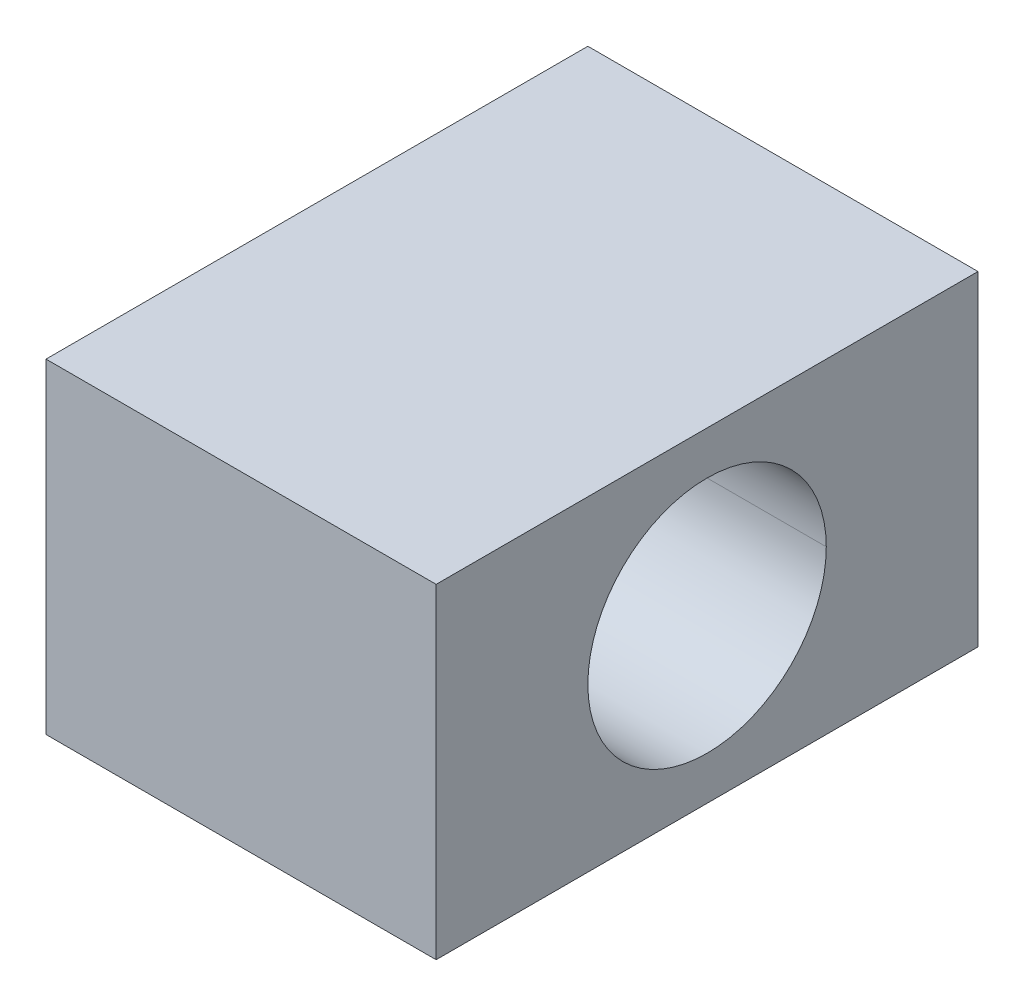
ISO-10303-21;
HEADER;
FILE_DESCRIPTION(('STEP AP214'),'2;1');
FILE_NAME('part.step','',(''),(''),'','','');
FILE_SCHEMA(('AUTOMOTIVE_DESIGN { 1 0 10303 214 1 1 1 1 }'));
ENDSEC;
DATA;
#1=APPLICATION_CONTEXT('core data for automotive mechanical design processes');
#2=APPLICATION_PROTOCOL_DEFINITION('international standard','automotive_design',2000,#1);
#3=PRODUCT_CONTEXT('',#1,'mechanical');
#4=PRODUCT('Part','Part','',(#3));
#5=PRODUCT_RELATED_PRODUCT_CATEGORY('part','',(#4));
#6=PRODUCT_DEFINITION_FORMATION('','',#4);
#7=PRODUCT_DEFINITION_CONTEXT('part definition',#1,'design');
#8=PRODUCT_DEFINITION('design','',#6,#7);
#9=PRODUCT_DEFINITION_SHAPE('','',#8);
#10=(LENGTH_UNIT() NAMED_UNIT(*) SI_UNIT(.MILLI.,.METRE.));
#11=(NAMED_UNIT(*) PLANE_ANGLE_UNIT() SI_UNIT($,.RADIAN.));
#12=(NAMED_UNIT(*) SI_UNIT($,.STERADIAN.) SOLID_ANGLE_UNIT());
#13=UNCERTAINTY_MEASURE_WITH_UNIT(LENGTH_MEASURE(1.E-05),#10,'distance_accuracy_value','');
#14=(GEOMETRIC_REPRESENTATION_CONTEXT(3) GLOBAL_UNCERTAINTY_ASSIGNED_CONTEXT((#13)) GLOBAL_UNIT_ASSIGNED_CONTEXT((#10,
#11,#12)) REPRESENTATION_CONTEXT('',''));
#15=CARTESIAN_POINT('',(0.,0.,0.));
#16=DIRECTION('',(0.,0.,1.));
#17=DIRECTION('',(1.,0.,0.));
#18=AXIS2_PLACEMENT_3D('',#15,#16,#17);
#19=CARTESIAN_POINT('',(-30.,-15.,-17.5));
#20=DIRECTION('',(0.,-1.,0.));
#21=DIRECTION('',(0.,0.,-1.));
#22=AXIS2_PLACEMENT_3D('',#19,#20,#21);
#23=CYLINDRICAL_SURFACE('',#22,2.1);
#24=CARTESIAN_POINT('',(-30.,-1.,-17.5));
#25=DIRECTION('',(0.,-1.,0.));
#26=DIRECTION('',(0.,0.,-1.));
#27=AXIS2_PLACEMENT_3D('',#24,#25,#26);
#28=CIRCLE('',#27,2.1);
#29=CARTESIAN_POINT('',(-30.,-1.,-15.4));
#30=VERTEX_POINT('',#29);
#31=CARTESIAN_POINT('',(-30.,-1.,-19.6));
#32=VERTEX_POINT('',#31);
#33=EDGE_CURVE('E41',#30,#32,#28,.T.);
#34=ORIENTED_EDGE('',*,*,#33,.F.);
#35=DIRECTION('',(0.,-1.,0.));
#36=VECTOR('',#35,1.);
#37=CARTESIAN_POINT('',(-30.,-15.,-15.4));
#38=LINE('',#37,#36);
#39=CARTESIAN_POINT('',(-30.,-15.,-15.4));
#40=VERTEX_POINT('',#39);
#41=EDGE_CURVE('E11',#30,#40,#38,.T.);
#42=ORIENTED_EDGE('',*,*,#41,.T.);
#43=CARTESIAN_POINT('',(-30.,-15.,-17.5));
#44=DIRECTION('',(0.,-1.,0.));
#45=DIRECTION('',(0.,0.,-1.));
#46=AXIS2_PLACEMENT_3D('',#43,#44,#45);
#47=CIRCLE('',#46,2.1);
#48=CARTESIAN_POINT('',(-30.,-15.,-19.6));
#49=VERTEX_POINT('',#48);
#50=EDGE_CURVE('E27',#40,#49,#47,.T.);
#51=ORIENTED_EDGE('',*,*,#50,.T.);
#52=DIRECTION('',(0.,-1.,0.));
#53=VECTOR('',#52,1.);
#54=CARTESIAN_POINT('',(-30.,-15.,-19.6));
#55=LINE('',#54,#53);
#56=EDGE_CURVE('E356',#32,#49,#55,.T.);
#57=ORIENTED_EDGE('',*,*,#56,.F.);
#58=EDGE_LOOP('',(#34,#42,#51,#57));
#59=FACE_BOUND('',#58,.T.);
#60=ADVANCED_FACE('F16',(#59),#23,.F.);
#61=CARTESIAN_POINT('',(-30.,-1.,-17.5));
#62=DIRECTION('',(0.,-1.,0.));
#63=DIRECTION('',(0.,0.,-1.));
#64=AXIS2_PLACEMENT_3D('',#61,#62,#63);
#65=CONICAL_SURFACE('',#64,2.1,1.02974425867665);
#66=DIRECTION('',(0.,-0.515038074910055,-0.857167300702112));
#67=VECTOR('',#66,1.);
#68=CARTESIAN_POINT('',(-30.,-1.,-19.6));
#69=LINE('',#68,#67);
#70=CARTESIAN_POINT('',(-30.,0.261807299957877,-17.5));
#71=VERTEX_POINT('',#70);
#72=EDGE_CURVE('E324',#71,#32,#69,.T.);
#73=ORIENTED_EDGE('',*,*,#72,.F.);
#74=DIRECTION('',(0.,-0.515038074910055,0.857167300702112));
#75=VECTOR('',#74,1.);
#76=CARTESIAN_POINT('',(-30.,-1.,-15.4));
#77=LINE('',#76,#75);
#78=EDGE_CURVE('E325',#71,#30,#77,.T.);
#79=ORIENTED_EDGE('',*,*,#78,.T.);
#80=ORIENTED_EDGE('',*,*,#33,.T.);
#81=EDGE_LOOP('',(#73,#79,#80));
#82=FACE_BOUND('',#81,.T.);
#83=ADVANCED_FACE('F489',(#82),#65,.F.);
#84=CARTESIAN_POINT('',(-30.,-15.,17.5));
#85=DIRECTION('',(0.,-1.,0.));
#86=DIRECTION('',(0.,0.,-1.));
#87=AXIS2_PLACEMENT_3D('',#84,#85,#86);
#88=CYLINDRICAL_SURFACE('',#87,2.1);
#89=CARTESIAN_POINT('',(-30.,-1.,17.5));
#90=DIRECTION('',(0.,-1.,0.));
#91=DIRECTION('',(0.,0.,-1.));
#92=AXIS2_PLACEMENT_3D('',#89,#90,#91);
#93=CIRCLE('',#92,2.1);
#94=CARTESIAN_POINT('',(-30.,-1.,19.6));
#95=VERTEX_POINT('',#94);
#96=CARTESIAN_POINT('',(-30.,-1.,15.4));
#97=VERTEX_POINT('',#96);
#98=EDGE_CURVE('E289',#95,#97,#93,.T.);
#99=ORIENTED_EDGE('',*,*,#98,.F.);
#100=DIRECTION('',(0.,-1.,0.));
#101=VECTOR('',#100,1.);
#102=CARTESIAN_POINT('',(-30.,-15.,19.6));
#103=LINE('',#102,#101);
#104=CARTESIAN_POINT('',(-30.,-15.,19.6));
#105=VERTEX_POINT('',#104);
#106=EDGE_CURVE('E228',#95,#105,#103,.T.);
#107=ORIENTED_EDGE('',*,*,#106,.T.);
#108=CARTESIAN_POINT('',(-30.,-15.,17.5));
#109=DIRECTION('',(0.,-1.,0.));
#110=DIRECTION('',(0.,0.,-1.));
#111=AXIS2_PLACEMENT_3D('',#108,#109,#110);
#112=CIRCLE('',#111,2.1);
#113=CARTESIAN_POINT('',(-30.,-15.,15.4));
#114=VERTEX_POINT('',#113);
#115=EDGE_CURVE('E230',#105,#114,#112,.T.);
#116=ORIENTED_EDGE('',*,*,#115,.T.);
#117=DIRECTION('',(0.,-1.,0.));
#118=VECTOR('',#117,1.);
#119=CARTESIAN_POINT('',(-30.,-15.,15.4));
#120=LINE('',#119,#118);
#121=EDGE_CURVE('E303',#97,#114,#120,.T.);
#122=ORIENTED_EDGE('',*,*,#121,.F.);
#123=EDGE_LOOP('',(#99,#107,#116,#122));
#124=FACE_BOUND('',#123,.T.);
#125=ADVANCED_FACE('F484',(#124),#88,.F.);
#126=CARTESIAN_POINT('',(-30.,-1.,17.5));
#127=DIRECTION('',(0.,-1.,0.));
#128=DIRECTION('',(0.,0.,-1.));
#129=AXIS2_PLACEMENT_3D('',#126,#127,#128);
#130=CONICAL_SURFACE('',#129,2.1,1.02974425867665);
#131=DIRECTION('',(0.,-0.515038074910055,-0.857167300702112));
#132=VECTOR('',#131,1.);
#133=CARTESIAN_POINT('',(-30.,-1.,15.4));
#134=LINE('',#133,#132);
#135=CARTESIAN_POINT('',(-30.,0.261807299957877,17.5));
#136=VERTEX_POINT('',#135);
#137=EDGE_CURVE('E370',#136,#97,#134,.T.);
#138=ORIENTED_EDGE('',*,*,#137,.F.);
#139=DIRECTION('',(0.,-0.515038074910055,0.857167300702112));
#140=VECTOR('',#139,1.);
#141=CARTESIAN_POINT('',(-30.,-1.,19.6));
#142=LINE('',#141,#140);
#143=EDGE_CURVE('E287',#136,#95,#142,.T.);
#144=ORIENTED_EDGE('',*,*,#143,.T.);
#145=ORIENTED_EDGE('',*,*,#98,.T.);
#146=EDGE_LOOP('',(#138,#144,#145));
#147=FACE_BOUND('',#146,.T.);
#148=ADVANCED_FACE('F18',(#147),#130,.F.);
#149=CARTESIAN_POINT('',(-6.,-15.,17.5));
#150=DIRECTION('',(0.,-1.,0.));
#151=DIRECTION('',(0.,0.,-1.));
#152=AXIS2_PLACEMENT_3D('',#149,#150,#151);
#153=CYLINDRICAL_SURFACE('',#152,2.1);
#154=CARTESIAN_POINT('',(-6.,-1.,17.5));
#155=DIRECTION('',(0.,-1.,0.));
#156=DIRECTION('',(0.,0.,-1.));
#157=AXIS2_PLACEMENT_3D('',#154,#155,#156);
#158=CIRCLE('',#157,2.1);
#159=CARTESIAN_POINT('',(-6.,-1.,19.6));
#160=VERTEX_POINT('',#159);
#161=CARTESIAN_POINT('',(-6.,-1.,15.4));
#162=VERTEX_POINT('',#161);
#163=EDGE_CURVE('E191',#160,#162,#158,.T.);
#164=ORIENTED_EDGE('',*,*,#163,.F.);
#165=DIRECTION('',(0.,-1.,0.));
#166=VECTOR('',#165,1.);
#167=CARTESIAN_POINT('',(-6.,-15.,19.6));
#168=LINE('',#167,#166);
#169=CARTESIAN_POINT('',(-6.,-15.,19.6));
#170=VERTEX_POINT('',#169);
#171=EDGE_CURVE('E218',#160,#170,#168,.T.);
#172=ORIENTED_EDGE('',*,*,#171,.T.);
#173=CARTESIAN_POINT('',(-6.,-15.,17.5));
#174=DIRECTION('',(0.,-1.,0.));
#175=DIRECTION('',(0.,0.,-1.));
#176=AXIS2_PLACEMENT_3D('',#173,#174,#175);
#177=CIRCLE('',#176,2.1);
#178=CARTESIAN_POINT('',(-6.,-15.,15.4));
#179=VERTEX_POINT('',#178);
#180=EDGE_CURVE('E193',#170,#179,#177,.T.);
#181=ORIENTED_EDGE('',*,*,#180,.T.);
#182=DIRECTION('',(0.,-1.,0.));
#183=VECTOR('',#182,1.);
#184=CARTESIAN_POINT('',(-6.,-15.,15.4));
#185=LINE('',#184,#183);
#186=EDGE_CURVE('E186',#162,#179,#185,.T.);
#187=ORIENTED_EDGE('',*,*,#186,.F.);
#188=EDGE_LOOP('',(#164,#172,#181,#187));
#189=FACE_BOUND('',#188,.T.);
#190=ADVANCED_FACE('F188',(#189),#153,.F.);
#191=CARTESIAN_POINT('',(-6.,-1.,17.5));
#192=DIRECTION('',(0.,-1.,0.));
#193=DIRECTION('',(0.,0.,-1.));
#194=AXIS2_PLACEMENT_3D('',#191,#192,#193);
#195=CONICAL_SURFACE('',#194,2.1,1.02974425867665);
#196=DIRECTION('',(0.,-0.515038074910055,-0.857167300702112));
#197=VECTOR('',#196,1.);
#198=CARTESIAN_POINT('',(-6.,-1.,15.4));
#199=LINE('',#198,#197);
#200=CARTESIAN_POINT('',(-6.,0.261807299957877,17.5));
#201=VERTEX_POINT('',#200);
#202=EDGE_CURVE('E205',#201,#162,#199,.T.);
#203=ORIENTED_EDGE('',*,*,#202,.F.);
#204=DIRECTION('',(0.,-0.515038074910055,0.857167300702112));
#205=VECTOR('',#204,1.);
#206=CARTESIAN_POINT('',(-6.,-1.,19.6));
#207=LINE('',#206,#205);
#208=EDGE_CURVE('E207',#201,#160,#207,.T.);
#209=ORIENTED_EDGE('',*,*,#208,.T.);
#210=ORIENTED_EDGE('',*,*,#163,.T.);
#211=EDGE_LOOP('',(#203,#209,#210));
#212=FACE_BOUND('',#211,.T.);
#213=ADVANCED_FACE('F212',(#212),#195,.F.);
#214=CARTESIAN_POINT('',(-6.,-15.,-17.5));
#215=DIRECTION('',(0.,-1.,0.));
#216=DIRECTION('',(0.,0.,-1.));
#217=AXIS2_PLACEMENT_3D('',#214,#215,#216);
#218=CYLINDRICAL_SURFACE('',#217,2.1);
#219=CARTESIAN_POINT('',(-6.,-1.,-17.5));
#220=DIRECTION('',(0.,-1.,0.));
#221=DIRECTION('',(0.,0.,-1.));
#222=AXIS2_PLACEMENT_3D('',#219,#220,#221);
#223=CIRCLE('',#222,2.1);
#224=CARTESIAN_POINT('',(-6.,-1.,-15.4));
#225=VERTEX_POINT('',#224);
#226=CARTESIAN_POINT('',(-6.,-1.,-19.6));
#227=VERTEX_POINT('',#226);
#228=EDGE_CURVE('E330',#225,#227,#223,.T.);
#229=ORIENTED_EDGE('',*,*,#228,.F.);
#230=DIRECTION('',(0.,-1.,0.));
#231=VECTOR('',#230,1.);
#232=CARTESIAN_POINT('',(-6.,-15.,-15.4));
#233=LINE('',#232,#231);
#234=CARTESIAN_POINT('',(-6.,-15.,-15.4));
#235=VERTEX_POINT('',#234);
#236=EDGE_CURVE('E215',#225,#235,#233,.T.);
#237=ORIENTED_EDGE('',*,*,#236,.T.);
#238=CARTESIAN_POINT('',(-6.,-15.,-17.5));
#239=DIRECTION('',(0.,-1.,0.));
#240=DIRECTION('',(0.,0.,-1.));
#241=AXIS2_PLACEMENT_3D('',#238,#239,#240);
#242=CIRCLE('',#241,2.1);
#243=CARTESIAN_POINT('',(-6.,-15.,-19.6));
#244=VERTEX_POINT('',#243);
#245=EDGE_CURVE('E307',#235,#244,#242,.T.);
#246=ORIENTED_EDGE('',*,*,#245,.T.);
#247=DIRECTION('',(0.,-1.,0.));
#248=VECTOR('',#247,1.);
#249=CARTESIAN_POINT('',(-6.,-15.,-19.6));
#250=LINE('',#249,#248);
#251=EDGE_CURVE('E235',#227,#244,#250,.T.);
#252=ORIENTED_EDGE('',*,*,#251,.F.);
#253=EDGE_LOOP('',(#229,#237,#246,#252));
#254=FACE_BOUND('',#253,.T.);
#255=ADVANCED_FACE('F424',(#254),#218,.F.);
#256=CARTESIAN_POINT('',(-6.,-1.,-17.5));
#257=DIRECTION('',(0.,-1.,0.));
#258=DIRECTION('',(0.,0.,-1.));
#259=AXIS2_PLACEMENT_3D('',#256,#257,#258);
#260=CONICAL_SURFACE('',#259,2.1,1.02974425867665);
#261=DIRECTION('',(0.,-0.515038074910055,-0.857167300702112));
#262=VECTOR('',#261,1.);
#263=CARTESIAN_POINT('',(-6.,-1.,-19.6));
#264=LINE('',#263,#262);
#265=CARTESIAN_POINT('',(-6.,0.261807299957877,-17.5));
#266=VERTEX_POINT('',#265);
#267=EDGE_CURVE('E234',#266,#227,#264,.T.);
#268=ORIENTED_EDGE('',*,*,#267,.F.);
#269=DIRECTION('',(0.,-0.515038074910055,0.857167300702112));
#270=VECTOR('',#269,1.);
#271=CARTESIAN_POINT('',(-6.,-1.,-15.4));
#272=LINE('',#271,#270);
#273=EDGE_CURVE('E334',#266,#225,#272,.T.);
#274=ORIENTED_EDGE('',*,*,#273,.T.);
#275=ORIENTED_EDGE('',*,*,#228,.T.);
#276=EDGE_LOOP('',(#268,#274,#275));
#277=FACE_BOUND('',#276,.T.);
#278=ADVANCED_FACE('F427',(#277),#260,.F.);
#279=CARTESIAN_POINT('',(-36.,0.,0.));
#280=DIRECTION('',(1.,0.,0.));
#281=DIRECTION('',(0.,0.,-1.));
#282=AXIS2_PLACEMENT_3D('',#279,#280,#281);
#283=CYLINDRICAL_SURFACE('',#282,11.);
#284=CARTESIAN_POINT('',(-36.,0.,0.));
#285=DIRECTION('',(-1.,0.,0.));
#286=DIRECTION('',(0.,0.,1.));
#287=AXIS2_PLACEMENT_3D('',#284,#285,#286);
#288=CIRCLE('',#287,11.);
#289=CARTESIAN_POINT('',(-36.,0.,-11.));
#290=VERTEX_POINT('',#289);
#291=CARTESIAN_POINT('',(-36.,0.,11.));
#292=VERTEX_POINT('',#291);
#293=EDGE_CURVE('E318',#290,#292,#288,.T.);
#294=ORIENTED_EDGE('',*,*,#293,.T.);
#295=DIRECTION('',(1.,0.,0.));
#296=VECTOR('',#295,1.);
#297=CARTESIAN_POINT('',(-36.,0.,11.));
#298=LINE('',#297,#296);
#299=CARTESIAN_POINT('',(0.,0.,11.));
#300=VERTEX_POINT('',#299);
#301=EDGE_CURVE('E314',#292,#300,#298,.T.);
#302=ORIENTED_EDGE('',*,*,#301,.T.);
#303=CARTESIAN_POINT('',(0.,0.,0.));
#304=DIRECTION('',(-1.,0.,0.));
#305=DIRECTION('',(0.,0.,1.));
#306=AXIS2_PLACEMENT_3D('',#303,#304,#305);
#307=CIRCLE('',#306,11.);
#308=CARTESIAN_POINT('',(0.,0.,-11.));
#309=VERTEX_POINT('',#308);
#310=EDGE_CURVE('E312',#309,#300,#307,.T.);
#311=ORIENTED_EDGE('',*,*,#310,.F.);
#312=DIRECTION('',(1.,0.,0.));
#313=VECTOR('',#312,1.);
#314=CARTESIAN_POINT('',(-36.,0.,-11.));
#315=LINE('',#314,#313);
#316=EDGE_CURVE('E244',#290,#309,#315,.T.);
#317=ORIENTED_EDGE('',*,*,#316,.F.);
#318=EDGE_LOOP('',(#294,#302,#311,#317));
#319=FACE_BOUND('',#318,.T.);
#320=ADVANCED_FACE('F636',(#319),#283,.F.);
#321=CARTESIAN_POINT('',(-36.,0.,0.));
#322=DIRECTION('',(-1.,0.,0.));
#323=DIRECTION('',(0.,0.,1.));
#324=AXIS2_PLACEMENT_3D('',#321,#322,#323);
#325=PLANE('',#324);
#326=DIRECTION('',(0.,0.,1.));
#327=VECTOR('',#326,1.);
#328=CARTESIAN_POINT('',(-36.,-15.,25.));
#329=LINE('',#328,#327);
#330=CARTESIAN_POINT('',(-36.,-15.,-25.));
#331=VERTEX_POINT('',#330);
#332=CARTESIAN_POINT('',(-36.,-15.,25.));
#333=VERTEX_POINT('',#332);
#334=EDGE_CURVE('E319',#331,#333,#329,.T.);
#335=ORIENTED_EDGE('',*,*,#334,.T.);
#336=DIRECTION('',(0.,1.,0.));
#337=VECTOR('',#336,1.);
#338=CARTESIAN_POINT('',(-36.,15.,25.));
#339=LINE('',#338,#337);
#340=CARTESIAN_POINT('',(-36.,15.,25.));
#341=VERTEX_POINT('',#340);
#342=EDGE_CURVE('E259',#333,#341,#339,.T.);
#343=ORIENTED_EDGE('',*,*,#342,.T.);
#344=DIRECTION('',(0.,0.,-1.));
#345=VECTOR('',#344,1.);
#346=CARTESIAN_POINT('',(-36.,15.,25.));
#347=LINE('',#346,#345);
#348=CARTESIAN_POINT('',(-36.,15.,-25.));
#349=VERTEX_POINT('',#348);
#350=EDGE_CURVE('E258',#341,#349,#347,.T.);
#351=ORIENTED_EDGE('',*,*,#350,.T.);
#352=DIRECTION('',(0.,-1.,0.));
#353=VECTOR('',#352,1.);
#354=CARTESIAN_POINT('',(-36.,15.,-25.));
#355=LINE('',#354,#353);
#356=EDGE_CURVE('E152',#349,#331,#355,.T.);
#357=ORIENTED_EDGE('',*,*,#356,.T.);
#358=EDGE_LOOP('',(#335,#343,#351,#357));
#359=FACE_BOUND('',#358,.T.);
#360=ORIENTED_EDGE('',*,*,#293,.F.);
#361=CARTESIAN_POINT('',(-36.,0.,0.));
#362=DIRECTION('',(-1.,0.,0.));
#363=DIRECTION('',(0.,0.,1.));
#364=AXIS2_PLACEMENT_3D('',#361,#362,#363);
#365=CIRCLE('',#364,11.);
#366=EDGE_CURVE('E335',#292,#290,#365,.T.);
#367=ORIENTED_EDGE('',*,*,#366,.F.);
#368=EDGE_LOOP('',(#360,#367));
#369=FACE_BOUND('',#368,.T.);
#370=ADVANCED_FACE('F593',(#359,#369),#325,.T.);
#371=CARTESIAN_POINT('',(0.,0.,0.));
#372=DIRECTION('',(-1.,0.,0.));
#373=DIRECTION('',(0.,0.,1.));
#374=AXIS2_PLACEMENT_3D('',#371,#372,#373);
#375=PLANE('',#374);
#376=DIRECTION('',(0.,0.,1.));
#377=VECTOR('',#376,1.);
#378=CARTESIAN_POINT('',(0.,-15.,25.));
#379=LINE('',#378,#377);
#380=CARTESIAN_POINT('',(0.,-15.,-25.));
#381=VERTEX_POINT('',#380);
#382=CARTESIAN_POINT('',(0.,-15.,25.));
#383=VERTEX_POINT('',#382);
#384=EDGE_CURVE('E313',#381,#383,#379,.T.);
#385=ORIENTED_EDGE('',*,*,#384,.F.);
#386=DIRECTION('',(0.,-1.,0.));
#387=VECTOR('',#386,1.);
#388=CARTESIAN_POINT('',(0.,15.,-25.));
#389=LINE('',#388,#387);
#390=CARTESIAN_POINT('',(0.,15.,-25.));
#391=VERTEX_POINT('',#390);
#392=EDGE_CURVE('E129',#391,#381,#389,.T.);
#393=ORIENTED_EDGE('',*,*,#392,.F.);
#394=DIRECTION('',(0.,0.,-1.));
#395=VECTOR('',#394,1.);
#396=CARTESIAN_POINT('',(0.,15.,25.));
#397=LINE('',#396,#395);
#398=CARTESIAN_POINT('',(0.,15.,25.));
#399=VERTEX_POINT('',#398);
#400=EDGE_CURVE('E136',#399,#391,#397,.T.);
#401=ORIENTED_EDGE('',*,*,#400,.F.);
#402=DIRECTION('',(0.,1.,0.));
#403=VECTOR('',#402,1.);
#404=CARTESIAN_POINT('',(0.,15.,25.));
#405=LINE('',#404,#403);
#406=EDGE_CURVE('E270',#383,#399,#405,.T.);
#407=ORIENTED_EDGE('',*,*,#406,.F.);
#408=EDGE_LOOP('',(#385,#393,#401,#407));
#409=FACE_BOUND('',#408,.T.);
#410=ORIENTED_EDGE('',*,*,#310,.T.);
#411=CARTESIAN_POINT('',(0.,0.,0.));
#412=DIRECTION('',(-1.,0.,0.));
#413=DIRECTION('',(0.,0.,1.));
#414=AXIS2_PLACEMENT_3D('',#411,#412,#413);
#415=CIRCLE('',#414,11.);
#416=EDGE_CURVE('E308',#300,#309,#415,.T.);
#417=ORIENTED_EDGE('',*,*,#416,.T.);
#418=EDGE_LOOP('',(#410,#417));
#419=FACE_BOUND('',#418,.T.);
#420=ADVANCED_FACE('F414',(#409,#419),#375,.F.);
#421=CARTESIAN_POINT('',(-36.,-15.,25.));
#422=DIRECTION('',(0.,1.,0.));
#423=DIRECTION('',(1.,0.,0.));
#424=AXIS2_PLACEMENT_3D('',#421,#422,#423);
#425=PLANE('',#424);
#426=ORIENTED_EDGE('',*,*,#384,.T.);
#427=DIRECTION('',(1.,0.,0.));
#428=VECTOR('',#427,1.);
#429=CARTESIAN_POINT('',(-36.,-15.,25.));
#430=LINE('',#429,#428);
#431=EDGE_CURVE('E261',#333,#383,#430,.T.);
#432=ORIENTED_EDGE('',*,*,#431,.F.);
#433=ORIENTED_EDGE('',*,*,#334,.F.);
#434=DIRECTION('',(1.,0.,0.));
#435=VECTOR('',#434,1.);
#436=CARTESIAN_POINT('',(-36.,-15.,-25.));
#437=LINE('',#436,#435);
#438=EDGE_CURVE('E348',#331,#381,#437,.T.);
#439=ORIENTED_EDGE('',*,*,#438,.T.);
#440=EDGE_LOOP('',(#426,#432,#433,#439));
#441=FACE_BOUND('',#440,.T.);
#442=CARTESIAN_POINT('',(-30.,-15.,-17.5));
#443=DIRECTION('',(0.,-1.,0.));
#444=DIRECTION('',(0.,0.,-1.));
#445=AXIS2_PLACEMENT_3D('',#442,#443,#444);
#446=CIRCLE('',#445,2.1);
#447=EDGE_CURVE('E352',#49,#40,#446,.T.);
#448=ORIENTED_EDGE('',*,*,#447,.F.);
#449=ORIENTED_EDGE('',*,*,#50,.F.);
#450=EDGE_LOOP('',(#448,#449));
#451=FACE_BOUND('',#450,.T.);
#452=CARTESIAN_POINT('',(-30.,-15.,17.5));
#453=DIRECTION('',(0.,-1.,0.));
#454=DIRECTION('',(0.,0.,-1.));
#455=AXIS2_PLACEMENT_3D('',#452,#453,#454);
#456=CIRCLE('',#455,2.1);
#457=EDGE_CURVE('E320',#114,#105,#456,.T.);
#458=ORIENTED_EDGE('',*,*,#457,.F.);
#459=ORIENTED_EDGE('',*,*,#115,.F.);
#460=EDGE_LOOP('',(#458,#459));
#461=FACE_BOUND('',#460,.T.);
#462=CARTESIAN_POINT('',(-6.,-15.,17.5));
#463=DIRECTION('',(0.,-1.,0.));
#464=DIRECTION('',(0.,0.,-1.));
#465=AXIS2_PLACEMENT_3D('',#462,#463,#464);
#466=CIRCLE('',#465,2.1);
#467=EDGE_CURVE('E200',#179,#170,#466,.T.);
#468=ORIENTED_EDGE('',*,*,#467,.F.);
#469=ORIENTED_EDGE('',*,*,#180,.F.);
#470=EDGE_LOOP('',(#468,#469));
#471=FACE_BOUND('',#470,.T.);
#472=CARTESIAN_POINT('',(-6.,-15.,-17.5));
#473=DIRECTION('',(0.,-1.,0.));
#474=DIRECTION('',(0.,0.,-1.));
#475=AXIS2_PLACEMENT_3D('',#472,#473,#474);
#476=CIRCLE('',#475,2.1);
#477=EDGE_CURVE('E210',#244,#235,#476,.T.);
#478=ORIENTED_EDGE('',*,*,#477,.F.);
#479=ORIENTED_EDGE('',*,*,#245,.F.);
#480=EDGE_LOOP('',(#478,#479));
#481=FACE_BOUND('',#480,.T.);
#482=ADVANCED_FACE('F410',(#441,#451,#461,#471,#481),#425,.F.);
#483=CARTESIAN_POINT('',(-36.,15.,25.));
#484=DIRECTION('',(0.,0.,-1.));
#485=DIRECTION('',(0.,-1.,0.));
#486=AXIS2_PLACEMENT_3D('',#483,#484,#485);
#487=PLANE('',#486);
#488=ORIENTED_EDGE('',*,*,#406,.T.);
#489=DIRECTION('',(1.,0.,0.));
#490=VECTOR('',#489,1.);
#491=CARTESIAN_POINT('',(-36.,15.,25.));
#492=LINE('',#491,#490);
#493=EDGE_CURVE('E262',#341,#399,#492,.T.);
#494=ORIENTED_EDGE('',*,*,#493,.F.);
#495=ORIENTED_EDGE('',*,*,#342,.F.);
#496=ORIENTED_EDGE('',*,*,#431,.T.);
#497=EDGE_LOOP('',(#488,#494,#495,#496));
#498=FACE_BOUND('',#497,.T.);
#499=ADVANCED_FACE('F413',(#498),#487,.F.);
#500=CARTESIAN_POINT('',(-36.,15.,25.));
#501=DIRECTION('',(0.,-1.,0.));
#502=DIRECTION('',(-1.,0.,0.));
#503=AXIS2_PLACEMENT_3D('',#500,#501,#502);
#504=PLANE('',#503);
#505=ORIENTED_EDGE('',*,*,#400,.T.);
#506=DIRECTION('',(1.,0.,0.));
#507=VECTOR('',#506,1.);
#508=CARTESIAN_POINT('',(-36.,15.,-25.));
#509=LINE('',#508,#507);
#510=EDGE_CURVE('E280',#349,#391,#509,.T.);
#511=ORIENTED_EDGE('',*,*,#510,.F.);
#512=ORIENTED_EDGE('',*,*,#350,.F.);
#513=ORIENTED_EDGE('',*,*,#493,.T.);
#514=EDGE_LOOP('',(#505,#511,#512,#513));
#515=FACE_BOUND('',#514,.T.);
#516=ADVANCED_FACE('F598',(#515),#504,.F.);
#517=CARTESIAN_POINT('',(-36.,15.,-25.));
#518=DIRECTION('',(0.,0.,1.));
#519=DIRECTION('',(1.,0.,0.));
#520=AXIS2_PLACEMENT_3D('',#517,#518,#519);
#521=PLANE('',#520);
#522=ORIENTED_EDGE('',*,*,#392,.T.);
#523=ORIENTED_EDGE('',*,*,#438,.F.);
#524=ORIENTED_EDGE('',*,*,#356,.F.);
#525=ORIENTED_EDGE('',*,*,#510,.T.);
#526=EDGE_LOOP('',(#522,#523,#524,#525));
#527=FACE_BOUND('',#526,.T.);
#528=ADVANCED_FACE('F602',(#527),#521,.F.);
#529=CARTESIAN_POINT('',(-36.,0.,0.));
#530=DIRECTION('',(1.,0.,0.));
#531=DIRECTION('',(0.,0.,-1.));
#532=AXIS2_PLACEMENT_3D('',#529,#530,#531);
#533=CYLINDRICAL_SURFACE('',#532,11.);
#534=ORIENTED_EDGE('',*,*,#301,.F.);
#535=ORIENTED_EDGE('',*,*,#366,.T.);
#536=ORIENTED_EDGE('',*,*,#316,.T.);
#537=ORIENTED_EDGE('',*,*,#416,.F.);
#538=EDGE_LOOP('',(#534,#535,#536,#537));
#539=FACE_BOUND('',#538,.T.);
#540=ADVANCED_FACE('F578',(#539),#533,.F.);
#541=CARTESIAN_POINT('',(-6.,-1.,-17.5));
#542=DIRECTION('',(0.,-1.,0.));
#543=DIRECTION('',(0.,0.,-1.));
#544=AXIS2_PLACEMENT_3D('',#541,#542,#543);
#545=CONICAL_SURFACE('',#544,2.1,1.02974425867665);
#546=ORIENTED_EDGE('',*,*,#273,.F.);
#547=ORIENTED_EDGE('',*,*,#267,.T.);
#548=CARTESIAN_POINT('',(-6.,-1.,-17.5));
#549=DIRECTION('',(0.,-1.,0.));
#550=DIRECTION('',(0.,0.,-1.));
#551=AXIS2_PLACEMENT_3D('',#548,#549,#550);
#552=CIRCLE('',#551,2.1);
#553=EDGE_CURVE('E231',#227,#225,#552,.T.);
#554=ORIENTED_EDGE('',*,*,#553,.T.);
#555=EDGE_LOOP('',(#546,#547,#554));
#556=FACE_BOUND('',#555,.T.);
#557=ADVANCED_FACE('F428',(#556),#545,.F.);
#558=CARTESIAN_POINT('',(-6.,-15.,-17.5));
#559=DIRECTION('',(0.,-1.,0.));
#560=DIRECTION('',(0.,0.,-1.));
#561=AXIS2_PLACEMENT_3D('',#558,#559,#560);
#562=CYLINDRICAL_SURFACE('',#561,2.1);
#563=ORIENTED_EDGE('',*,*,#236,.F.);
#564=ORIENTED_EDGE('',*,*,#553,.F.);
#565=ORIENTED_EDGE('',*,*,#251,.T.);
#566=ORIENTED_EDGE('',*,*,#477,.T.);
#567=EDGE_LOOP('',(#563,#564,#565,#566));
#568=FACE_BOUND('',#567,.T.);
#569=ADVANCED_FACE('F422',(#568),#562,.F.);
#570=CARTESIAN_POINT('',(-6.,-1.,17.5));
#571=DIRECTION('',(0.,-1.,0.));
#572=DIRECTION('',(0.,0.,-1.));
#573=AXIS2_PLACEMENT_3D('',#570,#571,#572);
#574=CONICAL_SURFACE('',#573,2.1,1.02974425867665);
#575=ORIENTED_EDGE('',*,*,#208,.F.);
#576=ORIENTED_EDGE('',*,*,#202,.T.);
#577=CARTESIAN_POINT('',(-6.,-1.,17.5));
#578=DIRECTION('',(0.,-1.,0.));
#579=DIRECTION('',(0.,0.,-1.));
#580=AXIS2_PLACEMENT_3D('',#577,#578,#579);
#581=CIRCLE('',#580,2.1);
#582=EDGE_CURVE('E199',#162,#160,#581,.T.);
#583=ORIENTED_EDGE('',*,*,#582,.T.);
#584=EDGE_LOOP('',(#575,#576,#583));
#585=FACE_BOUND('',#584,.T.);
#586=ADVANCED_FACE('F206',(#585),#574,.F.);
#587=CARTESIAN_POINT('',(-6.,-15.,17.5));
#588=DIRECTION('',(0.,-1.,0.));
#589=DIRECTION('',(0.,0.,-1.));
#590=AXIS2_PLACEMENT_3D('',#587,#588,#589);
#591=CYLINDRICAL_SURFACE('',#590,2.1);
#592=ORIENTED_EDGE('',*,*,#171,.F.);
#593=ORIENTED_EDGE('',*,*,#582,.F.);
#594=ORIENTED_EDGE('',*,*,#186,.T.);
#595=ORIENTED_EDGE('',*,*,#467,.T.);
#596=EDGE_LOOP('',(#592,#593,#594,#595));
#597=FACE_BOUND('',#596,.T.);
#598=ADVANCED_FACE('F217',(#597),#591,.F.);
#599=CARTESIAN_POINT('',(-30.,-1.,17.5));
#600=DIRECTION('',(0.,-1.,0.));
#601=DIRECTION('',(0.,0.,-1.));
#602=AXIS2_PLACEMENT_3D('',#599,#600,#601);
#603=CONICAL_SURFACE('',#602,2.1,1.02974425867665);
#604=ORIENTED_EDGE('',*,*,#143,.F.);
#605=ORIENTED_EDGE('',*,*,#137,.T.);
#606=CARTESIAN_POINT('',(-30.,-1.,17.5));
#607=DIRECTION('',(0.,-1.,0.));
#608=DIRECTION('',(0.,0.,-1.));
#609=AXIS2_PLACEMENT_3D('',#606,#607,#608);
#610=CIRCLE('',#609,2.1);
#611=EDGE_CURVE('E20',#97,#95,#610,.T.);
#612=ORIENTED_EDGE('',*,*,#611,.T.);
#613=EDGE_LOOP('',(#604,#605,#612));
#614=FACE_BOUND('',#613,.T.);
#615=ADVANCED_FACE('F522',(#614),#603,.F.);
#616=CARTESIAN_POINT('',(-30.,-15.,17.5));
#617=DIRECTION('',(0.,-1.,0.));
#618=DIRECTION('',(0.,0.,-1.));
#619=AXIS2_PLACEMENT_3D('',#616,#617,#618);
#620=CYLINDRICAL_SURFACE('',#619,2.1);
#621=ORIENTED_EDGE('',*,*,#106,.F.);
#622=ORIENTED_EDGE('',*,*,#611,.F.);
#623=ORIENTED_EDGE('',*,*,#121,.T.);
#624=ORIENTED_EDGE('',*,*,#457,.T.);
#625=EDGE_LOOP('',(#621,#622,#623,#624));
#626=FACE_BOUND('',#625,.T.);
#627=ADVANCED_FACE('F518',(#626),#620,.F.);
#628=CARTESIAN_POINT('',(-30.,-1.,-17.5));
#629=DIRECTION('',(0.,-1.,0.));
#630=DIRECTION('',(0.,0.,-1.));
#631=AXIS2_PLACEMENT_3D('',#628,#629,#630);
#632=CONICAL_SURFACE('',#631,2.1,1.02974425867665);
#633=ORIENTED_EDGE('',*,*,#78,.F.);
#634=ORIENTED_EDGE('',*,*,#72,.T.);
#635=CARTESIAN_POINT('',(-30.,-1.,-17.5));
#636=DIRECTION('',(0.,-1.,0.));
#637=DIRECTION('',(0.,0.,-1.));
#638=AXIS2_PLACEMENT_3D('',#635,#636,#637);
#639=CIRCLE('',#638,2.1);
#640=EDGE_CURVE('E284',#32,#30,#639,.T.);
#641=ORIENTED_EDGE('',*,*,#640,.T.);
#642=EDGE_LOOP('',(#633,#634,#641));
#643=FACE_BOUND('',#642,.T.);
#644=ADVANCED_FACE('F399',(#643),#632,.F.);
#645=CARTESIAN_POINT('',(-30.,-15.,-17.5));
#646=DIRECTION('',(0.,-1.,0.));
#647=DIRECTION('',(0.,0.,-1.));
#648=AXIS2_PLACEMENT_3D('',#645,#646,#647);
#649=CYLINDRICAL_SURFACE('',#648,2.1);
#650=ORIENTED_EDGE('',*,*,#41,.F.);
#651=ORIENTED_EDGE('',*,*,#640,.F.);
#652=ORIENTED_EDGE('',*,*,#56,.T.);
#653=ORIENTED_EDGE('',*,*,#447,.T.);
#654=EDGE_LOOP('',(#650,#651,#652,#653));
#655=FACE_BOUND('',#654,.T.);
#656=ADVANCED_FACE('F402',(#655),#649,.F.);
#657=CLOSED_SHELL('',(#60,#83,#125,#148,#190,#213,#255,#278,#320,#370,#420,#482,#499,#516,#528,
#540,#557,#569,#586,#598,#615,#627,#644,#656));
#658=MANIFOLD_SOLID_BREP('B1',#657);
#659=ADVANCED_BREP_SHAPE_REPRESENTATION('',(#18,#658),#14);
#660=SHAPE_DEFINITION_REPRESENTATION(#9,#659);
ENDSEC;
END-ISO-10303-21;
